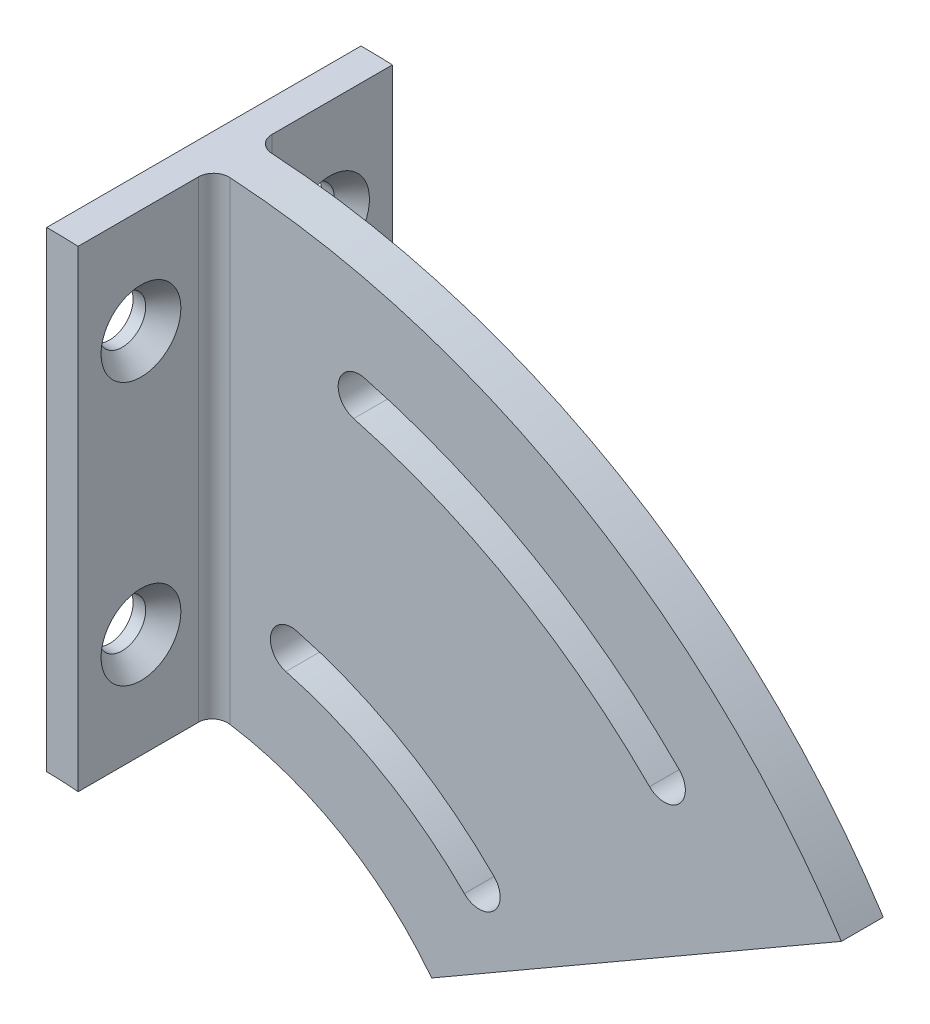
ISO-10303-21;
HEADER;
FILE_DESCRIPTION(('STEP AP214'),'2;1');
FILE_NAME('part.step','',(''),(''),'','','');
FILE_SCHEMA(('AUTOMOTIVE_DESIGN { 1 0 10303 214 1 1 1 1 }'));
ENDSEC;
DATA;
#1=APPLICATION_CONTEXT('core data for automotive mechanical design processes');
#2=APPLICATION_PROTOCOL_DEFINITION('international standard','automotive_design',2000,#1);
#3=PRODUCT_CONTEXT('',#1,'mechanical');
#4=PRODUCT('Part','Part','',(#3));
#5=PRODUCT_RELATED_PRODUCT_CATEGORY('part','',(#4));
#6=PRODUCT_DEFINITION_FORMATION('','',#4);
#7=PRODUCT_DEFINITION_CONTEXT('part definition',#1,'design');
#8=PRODUCT_DEFINITION('design','',#6,#7);
#9=PRODUCT_DEFINITION_SHAPE('','',#8);
#10=(LENGTH_UNIT() NAMED_UNIT(*) SI_UNIT(.MILLI.,.METRE.));
#11=(NAMED_UNIT(*) PLANE_ANGLE_UNIT() SI_UNIT($,.RADIAN.));
#12=(NAMED_UNIT(*) SI_UNIT($,.STERADIAN.) SOLID_ANGLE_UNIT());
#13=UNCERTAINTY_MEASURE_WITH_UNIT(LENGTH_MEASURE(1.E-05),#10,'distance_accuracy_value','');
#14=(GEOMETRIC_REPRESENTATION_CONTEXT(3) GLOBAL_UNCERTAINTY_ASSIGNED_CONTEXT((#13)) GLOBAL_UNIT_ASSIGNED_CONTEXT((#10,
#11,#12)) REPRESENTATION_CONTEXT('',''));
#15=CARTESIAN_POINT('',(0.,0.,0.));
#16=DIRECTION('',(0.,0.,1.));
#17=DIRECTION('',(1.,0.,0.));
#18=AXIS2_PLACEMENT_3D('',#15,#16,#17);
#19=CARTESIAN_POINT('',(-2.00000000000002,3.46410161513775,2.));
#20=DIRECTION('',(-0.500000000000004,0.866025403784436,0.));
#21=DIRECTION('',(-0.866025403784436,-0.500000000000004,0.));
#22=AXIS2_PLACEMENT_3D('',#19,#20,#21);
#23=PLANE('',#22);
#24=DIRECTION('',(0.866025403784436,0.500000000000004,0.));
#25=VECTOR('',#24,1.);
#26=CARTESIAN_POINT('',(-2.00000000000002,3.46410161513775,-2.));
#27=LINE('',#26,#25);
#28=CARTESIAN_POINT('',(23.7487863791674,18.3301703624564,-2.));
#29=VERTEX_POINT('',#28);
#30=CARTESIAN_POINT('',(62.8594634575401,40.9107303018436,-2.));
#31=VERTEX_POINT('',#30);
#32=EDGE_CURVE('E287',#29,#31,#27,.T.);
#33=ORIENTED_EDGE('',*,*,#32,.T.);
#34=DIRECTION('',(0.,0.,-1.));
#35=VECTOR('',#34,1.);
#36=CARTESIAN_POINT('',(62.8594634575401,40.9107303018436,2.));
#37=LINE('',#36,#35);
#38=CARTESIAN_POINT('',(62.8594634575401,40.9107303018436,2.));
#39=VERTEX_POINT('',#38);
#40=EDGE_CURVE('E300',#39,#31,#37,.T.);
#41=ORIENTED_EDGE('',*,*,#40,.F.);
#42=DIRECTION('',(0.866025403784436,0.500000000000004,0.));
#43=VECTOR('',#42,1.);
#44=CARTESIAN_POINT('',(-2.00000000000002,3.46410161513775,2.));
#45=LINE('',#44,#43);
#46=CARTESIAN_POINT('',(23.7487863791674,18.3301703624564,2.));
#47=VERTEX_POINT('',#46);
#48=EDGE_CURVE('E247',#47,#39,#45,.T.);
#49=ORIENTED_EDGE('',*,*,#48,.F.);
#50=DIRECTION('',(0.,0.,-1.));
#51=VECTOR('',#50,1.);
#52=CARTESIAN_POINT('',(23.7487863791674,18.3301703624564,2.));
#53=LINE('',#52,#51);
#54=EDGE_CURVE('E297',#47,#29,#53,.T.);
#55=ORIENTED_EDGE('',*,*,#54,.T.);
#56=EDGE_LOOP('',(#33,#41,#49,#55));
#57=FACE_BOUND('',#56,.T.);
#58=ADVANCED_FACE('F47',(#57),#23,.F.);
#59=CARTESIAN_POINT('',(0.,0.,2.));
#60=DIRECTION('',(0.,0.,-1.));
#61=DIRECTION('',(-1.,0.,0.));
#62=AXIS2_PLACEMENT_3D('',#59,#60,#61);
#63=CYLINDRICAL_SURFACE('',#62,75.);
#64=CARTESIAN_POINT('',(0.,0.,-2.));
#65=DIRECTION('',(0.,0.,1.));
#66=DIRECTION('',(1.,0.,0.));
#67=AXIS2_PLACEMENT_3D('',#64,#65,#66);
#68=CIRCLE('',#67,75.);
#69=CARTESIAN_POINT('',(4.5,74.8648782808067,-2.));
#70=VERTEX_POINT('',#69);
#71=EDGE_CURVE('E291',#31,#70,#68,.T.);
#72=ORIENTED_EDGE('',*,*,#71,.T.);
#73=CARTESIAN_POINT('',(4.5,74.8648782808067,-2.));
#74=CARTESIAN_POINT('',(4.45777980435427,74.8674162648847,-2.00000031695284));
#75=CARTESIAN_POINT('',(4.41557756249627,74.8699168792832,-2.00178366696298));
#76=CARTESIAN_POINT('',(4.33146997195856,74.8748298046333,-2.00889951308917));
#77=CARTESIAN_POINT('',(4.28956461142635,74.8772421191262,-2.01423186670088));
#78=CARTESIAN_POINT('',(4.16481265104597,74.8843190565613,-2.03550468509653));
#79=CARTESIAN_POINT('',(4.08279419593264,74.8888318335639,-2.05672103353361));
#80=CARTESIAN_POINT('',(3.92346468852666,74.8973484992588,-2.112646774287));
#81=CARTESIAN_POINT('',(3.84615609816962,74.901352122976,-2.14736315450511));
#82=CARTESIAN_POINT('',(3.69845818680558,74.9087903752296,-2.22930834480205));
#83=CARTESIAN_POINT('',(3.62806749754371,74.9122251163747,-2.27653467374875));
#84=CARTESIAN_POINT('',(3.49628931821994,74.9184911601753,-2.38210618038562));
#85=CARTESIAN_POINT('',(3.43489192136444,74.9213231284137,-2.44043895800311));
#86=CARTESIAN_POINT('',(3.32274647489676,74.9263806354733,-2.56661988940331));
#87=CARTESIAN_POINT('',(3.27200051451136,74.9286060553484,-2.63446990559962));
#88=CARTESIAN_POINT('',(3.18267160727606,74.9324536225646,-2.77766801192445));
#89=CARTESIAN_POINT('',(3.14407693594115,74.9340763517007,-2.85300878145447));
#90=CARTESIAN_POINT('',(3.08010074664251,74.9367333888482,-3.0090938273469));
#91=CARTESIAN_POINT('',(3.0547113316928,74.9377680485704,-3.08983484158068));
#92=CARTESIAN_POINT('',(3.02422374514937,74.9390032998763,-3.22589757013268));
#93=CARTESIAN_POINT('',(3.0151452925313,74.9393685716387,-3.28035917786629));
#94=CARTESIAN_POINT('',(3.00303427449589,74.9398545212724,-3.38987287177392));
#95=CARTESIAN_POINT('',(2.99999311454872,74.9399755468502,-3.44492400622536));
#96=CARTESIAN_POINT('',(3.,74.9399759807808,-3.5));
#97=B_SPLINE_CURVE_WITH_KNOTS('',3,(#73,#74,#75,#76,#77,#78,#79,#80,#81,#82,#83,#84,#85,#86,#87,
#88,#89,#90,#91,#92,#93,#94,#95,#96),.UNSPECIFIED.,.F.,.F.,(4,2,2,2,2,2,2,2,2,2,2,4),(0.,
0.126811517790267,0.253617943981932,0.506827327821661,0.760167953028892,1.01345837007314,
1.26646763558903,1.51952648134642,1.77234040309706,2.02500296313642,2.19033402326566,
2.35542955322012),.UNSPECIFIED.);
#98=CARTESIAN_POINT('',(3.,74.9399759807807,-3.5));
#99=VERTEX_POINT('',#98);
#100=EDGE_CURVE('E62',#70,#99,#97,.T.);
#101=ORIENTED_EDGE('',*,*,#100,.T.);
#102=DIRECTION('',(0.,0.,-1.));
#103=VECTOR('',#102,1.);
#104=CARTESIAN_POINT('',(3.,74.9399759807807,15.));
#105=LINE('',#104,#103);
#106=CARTESIAN_POINT('',(3.,74.9399759807807,-15.));
#107=VERTEX_POINT('',#106);
#108=EDGE_CURVE('E206',#99,#107,#105,.T.);
#109=ORIENTED_EDGE('',*,*,#108,.T.);
#110=CARTESIAN_POINT('',(0.,0.,-15.));
#111=DIRECTION('',(0.,0.,1.));
#112=DIRECTION('',(1.,0.,0.));
#113=AXIS2_PLACEMENT_3D('',#110,#111,#112);
#114=CIRCLE('',#113,75.);
#115=CARTESIAN_POINT('',(0.,75.,-15.));
#116=VERTEX_POINT('',#115);
#117=EDGE_CURVE('E458',#107,#116,#114,.T.);
#118=ORIENTED_EDGE('',*,*,#117,.T.);
#119=DIRECTION('',(0.,0.,-1.));
#120=VECTOR('',#119,1.);
#121=CARTESIAN_POINT('',(0.,75.,15.));
#122=LINE('',#121,#120);
#123=CARTESIAN_POINT('',(0.,75.,15.));
#124=VERTEX_POINT('',#123);
#125=EDGE_CURVE('E182',#124,#116,#122,.T.);
#126=ORIENTED_EDGE('',*,*,#125,.F.);
#127=CARTESIAN_POINT('',(0.,0.,15.));
#128=DIRECTION('',(0.,0.,1.));
#129=DIRECTION('',(1.,0.,0.));
#130=AXIS2_PLACEMENT_3D('',#127,#128,#129);
#131=CIRCLE('',#130,75.);
#132=CARTESIAN_POINT('',(3.,74.9399759807807,15.));
#133=VERTEX_POINT('',#132);
#134=EDGE_CURVE('E176',#133,#124,#131,.T.);
#135=ORIENTED_EDGE('',*,*,#134,.F.);
#136=CARTESIAN_POINT('',(3.,74.9399759807807,3.5));
#137=VERTEX_POINT('',#136);
#138=EDGE_CURVE('E180',#133,#137,#105,.T.);
#139=ORIENTED_EDGE('',*,*,#138,.T.);
#140=CARTESIAN_POINT('',(3.,74.9399759807807,3.5));
#141=CARTESIAN_POINT('',(3.0000002634625,74.9399757650584,3.4578262428091));
#142=CARTESIAN_POINT('',(3.00177974367625,74.9399047570605,3.41567269461653));
#143=CARTESIAN_POINT('',(3.00887869885395,74.9396201457445,3.33166735088973));
#144=CARTESIAN_POINT('',(3.01419800094302,74.9394065493898,3.28981554072035));
#145=CARTESIAN_POINT('',(3.03541467835634,74.9385513014973,3.16523687323369));
#146=CARTESIAN_POINT('',(3.05657096737965,74.9376951963688,3.08334467447728));
#147=CARTESIAN_POINT('',(3.11231772911564,74.9354004954242,2.92427999420264));
#148=CARTESIAN_POINT('',(3.14691459532293,74.9339616223797,2.84710977911817));
#149=CARTESIAN_POINT('',(3.22855212348645,74.9304885459524,2.69967824128908));
#150=CARTESIAN_POINT('',(3.27559063807879,74.9284544452964,2.62941572917857));
#151=CARTESIAN_POINT('',(3.38078313270072,74.9237817349491,2.49777459044907));
#152=CARTESIAN_POINT('',(3.43893958618147,74.9211429907145,2.4363979460533));
#153=CARTESIAN_POINT('',(3.56471878237382,74.9152636982268,2.32426731115949));
#154=CARTESIAN_POINT('',(3.63234335039084,74.9120230338933,2.27351537365859));
#155=CARTESIAN_POINT('',(3.77518321911707,74.9049604830548,2.18403927094436));
#156=CARTESIAN_POINT('',(3.85040564490313,74.9011380492466,2.14532653715862));
#157=CARTESIAN_POINT('',(4.00624013862916,74.8929643615934,2.08109434098785));
#158=CARTESIAN_POINT('',(4.08684916931042,74.8886134046451,2.0555675133953));
#159=CARTESIAN_POINT('',(4.2232834411006,74.8810179104093,2.02469126574216));
#160=CARTESIAN_POINT('',(4.2782639273522,74.8778972507124,2.01543693801216));
#161=CARTESIAN_POINT('',(4.38882338716534,74.8714987327121,2.00309209303521));
#162=CARTESIAN_POINT('',(4.4444013905691,74.8682211059997,1.99999276510663));
#163=CARTESIAN_POINT('',(4.5,74.8648782808067,2.));
#164=B_SPLINE_CURVE_WITH_KNOTS('',3,(#140,#141,#142,#143,#144,#145,#146,#147,#148,#149,#150,
#151,#152,#153,#154,#155,#156,#157,#158,#159,#160,#161,#162,#163),.UNSPECIFIED.,.F.,.F.,(4,2,2,
2,2,2,2,2,2,2,2,4),(0.,0.126443542336039,0.252880909981201,0.505334759188511,0.757908844494311,
1.01043936523855,1.26302613294937,1.51566166268756,1.76853634684521,2.02126963048289,
2.1884721855707,2.35543522262994),.UNSPECIFIED.);
#165=CARTESIAN_POINT('',(4.5,74.8648782808067,2.));
#166=VERTEX_POINT('',#165);
#167=EDGE_CURVE('E362',#137,#166,#164,.T.);
#168=ORIENTED_EDGE('',*,*,#167,.T.);
#169=CARTESIAN_POINT('',(0.,0.,2.));
#170=DIRECTION('',(0.,0.,1.));
#171=DIRECTION('',(1.,0.,0.));
#172=AXIS2_PLACEMENT_3D('',#169,#170,#171);
#173=CIRCLE('',#172,75.);
#174=EDGE_CURVE('E251',#39,#166,#173,.T.);
#175=ORIENTED_EDGE('',*,*,#174,.F.);
#176=ORIENTED_EDGE('',*,*,#40,.T.);
#177=EDGE_LOOP('',(#72,#101,#109,#118,#126,#135,#139,#168,#175,#176));
#178=FACE_BOUND('',#177,.T.);
#179=ADVANCED_FACE('F178',(#178),#63,.T.);
#180=CARTESIAN_POINT('',(10.3527618041011,38.6370330515627,2.));
#181=DIRECTION('',(0.,0.,-1.));
#182=DIRECTION('',(-1.,0.,0.));
#183=AXIS2_PLACEMENT_3D('',#180,#181,#182);
#184=CYLINDRICAL_SURFACE('',#183,2.);
#185=CARTESIAN_POINT('',(10.3527618041011,38.6370330515627,-2.));
#186=DIRECTION('',(0.,0.,1.));
#187=DIRECTION('',(1.,0.,0.));
#188=AXIS2_PLACEMENT_3D('',#185,#186,#187);
#189=CIRCLE('',#188,2.);
#190=CARTESIAN_POINT('',(10.8703998943062,40.5688847041408,-2.));
#191=VERTEX_POINT('',#190);
#192=CARTESIAN_POINT('',(9.83512371389607,36.7051813989845,-2.));
#193=VERTEX_POINT('',#192);
#194=EDGE_CURVE('E271',#191,#193,#189,.T.);
#195=ORIENTED_EDGE('',*,*,#194,.F.);
#196=DIRECTION('',(0.,0.,-1.));
#197=VECTOR('',#196,1.);
#198=CARTESIAN_POINT('',(10.8703998943062,40.5688847041408,2.));
#199=LINE('',#198,#197);
#200=CARTESIAN_POINT('',(10.8703998943062,40.5688847041408,2.));
#201=VERTEX_POINT('',#200);
#202=EDGE_CURVE('E301',#201,#191,#199,.T.);
#203=ORIENTED_EDGE('',*,*,#202,.F.);
#204=CARTESIAN_POINT('',(10.3527618041011,38.6370330515627,2.));
#205=DIRECTION('',(0.,0.,1.));
#206=DIRECTION('',(1.,0.,0.));
#207=AXIS2_PLACEMENT_3D('',#204,#205,#206);
#208=CIRCLE('',#207,2.);
#209=CARTESIAN_POINT('',(9.83512371389607,36.7051813989845,2.));
#210=VERTEX_POINT('',#209);
#211=EDGE_CURVE('E232',#201,#210,#208,.T.);
#212=ORIENTED_EDGE('',*,*,#211,.T.);
#213=DIRECTION('',(0.,0.,-1.));
#214=VECTOR('',#213,1.);
#215=CARTESIAN_POINT('',(9.83512371389607,36.7051813989845,2.));
#216=LINE('',#215,#214);
#217=EDGE_CURVE('E305',#210,#193,#216,.T.);
#218=ORIENTED_EDGE('',*,*,#217,.T.);
#219=EDGE_LOOP('',(#195,#203,#212,#218));
#220=FACE_BOUND('',#219,.T.);
#221=ADVANCED_FACE('F403',(#220),#184,.F.);
#222=CARTESIAN_POINT('',(0.,0.,2.));
#223=DIRECTION('',(0.,0.,-1.));
#224=DIRECTION('',(-1.,0.,0.));
#225=AXIS2_PLACEMENT_3D('',#222,#223,#224);
#226=CYLINDRICAL_SURFACE('',#225,42.);
#227=CARTESIAN_POINT('',(0.,0.,-2.));
#228=DIRECTION('',(0.,0.,1.));
#229=DIRECTION('',(1.,0.,0.));
#230=AXIS2_PLACEMENT_3D('',#227,#228,#229);
#231=CIRCLE('',#230,42.);
#232=CARTESIAN_POINT('',(29.698484809835,29.6984848098349,-2.));
#233=VERTEX_POINT('',#232);
#234=EDGE_CURVE('E275',#233,#191,#231,.T.);
#235=ORIENTED_EDGE('',*,*,#234,.F.);
#236=DIRECTION('',(0.,0.,-1.));
#237=VECTOR('',#236,1.);
#238=CARTESIAN_POINT('',(29.698484809835,29.6984848098349,2.));
#239=LINE('',#238,#237);
#240=CARTESIAN_POINT('',(29.698484809835,29.6984848098349,2.));
#241=VERTEX_POINT('',#240);
#242=EDGE_CURVE('E312',#241,#233,#239,.T.);
#243=ORIENTED_EDGE('',*,*,#242,.F.);
#244=CARTESIAN_POINT('',(0.,0.,2.));
#245=DIRECTION('',(0.,0.,1.));
#246=DIRECTION('',(1.,0.,0.));
#247=AXIS2_PLACEMENT_3D('',#244,#245,#246);
#248=CIRCLE('',#247,42.);
#249=EDGE_CURVE('E236',#241,#201,#248,.T.);
#250=ORIENTED_EDGE('',*,*,#249,.T.);
#251=ORIENTED_EDGE('',*,*,#202,.T.);
#252=EDGE_LOOP('',(#235,#243,#250,#251));
#253=FACE_BOUND('',#252,.T.);
#254=ADVANCED_FACE('F406',(#253),#226,.F.);
#255=CARTESIAN_POINT('',(28.2842712474619,28.2842712474618,2.));
#256=DIRECTION('',(0.,0.,-1.));
#257=DIRECTION('',(-1.,0.,0.));
#258=AXIS2_PLACEMENT_3D('',#255,#256,#257);
#259=CYLINDRICAL_SURFACE('',#258,2.);
#260=CARTESIAN_POINT('',(28.2842712474619,28.2842712474618,-2.));
#261=DIRECTION('',(0.,0.,1.));
#262=DIRECTION('',(1.,0.,0.));
#263=AXIS2_PLACEMENT_3D('',#260,#261,#262);
#264=CIRCLE('',#263,2.);
#265=CARTESIAN_POINT('',(26.8700576850888,26.8700576850888,-2.));
#266=VERTEX_POINT('',#265);
#267=EDGE_CURVE('E279',#266,#233,#264,.T.);
#268=ORIENTED_EDGE('',*,*,#267,.F.);
#269=DIRECTION('',(0.,0.,-1.));
#270=VECTOR('',#269,1.);
#271=CARTESIAN_POINT('',(26.8700576850888,26.8700576850888,2.));
#272=LINE('',#271,#270);
#273=CARTESIAN_POINT('',(26.8700576850888,26.8700576850888,2.));
#274=VERTEX_POINT('',#273);
#275=EDGE_CURVE('E308',#274,#266,#272,.T.);
#276=ORIENTED_EDGE('',*,*,#275,.F.);
#277=CARTESIAN_POINT('',(28.2842712474619,28.2842712474618,2.));
#278=DIRECTION('',(0.,0.,1.));
#279=DIRECTION('',(1.,0.,0.));
#280=AXIS2_PLACEMENT_3D('',#277,#278,#279);
#281=CIRCLE('',#280,2.);
#282=EDGE_CURVE('E240',#274,#241,#281,.T.);
#283=ORIENTED_EDGE('',*,*,#282,.T.);
#284=ORIENTED_EDGE('',*,*,#242,.T.);
#285=EDGE_LOOP('',(#268,#276,#283,#284));
#286=FACE_BOUND('',#285,.T.);
#287=ADVANCED_FACE('F388',(#286),#259,.F.);
#288=CARTESIAN_POINT('',(16.8232379316643,62.7851787087893,2.));
#289=DIRECTION('',(0.,0.,-1.));
#290=DIRECTION('',(-1.,0.,0.));
#291=AXIS2_PLACEMENT_3D('',#288,#289,#290);
#292=CYLINDRICAL_SURFACE('',#291,2.00000000000001);
#293=CARTESIAN_POINT('',(16.8232379316643,62.7851787087893,-2.));
#294=DIRECTION('',(0.,0.,1.));
#295=DIRECTION('',(1.,0.,0.));
#296=AXIS2_PLACEMENT_3D('',#293,#294,#295);
#297=CIRCLE('',#296,2.00000000000001);
#298=CARTESIAN_POINT('',(17.3408760218694,64.7170303613674,-2.));
#299=VERTEX_POINT('',#298);
#300=CARTESIAN_POINT('',(16.3055998414593,60.8533270562112,-2.));
#301=VERTEX_POINT('',#300);
#302=EDGE_CURVE('E205',#299,#301,#297,.T.);
#303=ORIENTED_EDGE('',*,*,#302,.F.);
#304=DIRECTION('',(0.,0.,-1.));
#305=VECTOR('',#304,1.);
#306=CARTESIAN_POINT('',(17.3408760218694,64.7170303613674,2.));
#307=LINE('',#306,#305);
#308=CARTESIAN_POINT('',(17.3408760218694,64.7170303613674,2.));
#309=VERTEX_POINT('',#308);
#310=EDGE_CURVE('E309',#309,#299,#307,.T.);
#311=ORIENTED_EDGE('',*,*,#310,.F.);
#312=CARTESIAN_POINT('',(16.8232379316643,62.7851787087893,2.));
#313=DIRECTION('',(0.,0.,1.));
#314=DIRECTION('',(1.,0.,0.));
#315=AXIS2_PLACEMENT_3D('',#312,#313,#314);
#316=CIRCLE('',#315,2.00000000000001);
#317=CARTESIAN_POINT('',(16.3055998414593,60.8533270562112,2.));
#318=VERTEX_POINT('',#317);
#319=EDGE_CURVE('E216',#309,#318,#316,.T.);
#320=ORIENTED_EDGE('',*,*,#319,.T.);
#321=DIRECTION('',(0.,0.,-1.));
#322=VECTOR('',#321,1.);
#323=CARTESIAN_POINT('',(16.3055998414593,60.8533270562112,2.));
#324=LINE('',#323,#322);
#325=EDGE_CURVE('E258',#318,#301,#324,.T.);
#326=ORIENTED_EDGE('',*,*,#325,.T.);
#327=EDGE_LOOP('',(#303,#311,#320,#326));
#328=FACE_BOUND('',#327,.T.);
#329=ADVANCED_FACE('F383',(#328),#292,.F.);
#330=CARTESIAN_POINT('',(0.,0.,2.));
#331=DIRECTION('',(0.,0.,-1.));
#332=DIRECTION('',(-1.,0.,0.));
#333=AXIS2_PLACEMENT_3D('',#330,#331,#332);
#334=CYLINDRICAL_SURFACE('',#333,67.);
#335=CARTESIAN_POINT('',(0.,0.,-2.));
#336=DIRECTION('',(0.,0.,1.));
#337=DIRECTION('',(1.,0.,0.));
#338=AXIS2_PLACEMENT_3D('',#335,#336,#337);
#339=CIRCLE('',#338,67.);
#340=CARTESIAN_POINT('',(47.3761543394988,47.3761543394986,-2.));
#341=VERTEX_POINT('',#340);
#342=EDGE_CURVE('E211',#341,#299,#339,.T.);
#343=ORIENTED_EDGE('',*,*,#342,.F.);
#344=DIRECTION('',(0.,0.,-1.));
#345=VECTOR('',#344,1.);
#346=CARTESIAN_POINT('',(47.3761543394988,47.3761543394986,2.));
#347=LINE('',#346,#345);
#348=CARTESIAN_POINT('',(47.3761543394988,47.3761543394986,2.));
#349=VERTEX_POINT('',#348);
#350=EDGE_CURVE('E322',#349,#341,#347,.T.);
#351=ORIENTED_EDGE('',*,*,#350,.F.);
#352=CARTESIAN_POINT('',(0.,0.,2.));
#353=DIRECTION('',(0.,0.,1.));
#354=DIRECTION('',(1.,0.,0.));
#355=AXIS2_PLACEMENT_3D('',#352,#353,#354);
#356=CIRCLE('',#355,67.);
#357=EDGE_CURVE('E220',#349,#309,#356,.T.);
#358=ORIENTED_EDGE('',*,*,#357,.T.);
#359=ORIENTED_EDGE('',*,*,#310,.T.);
#360=EDGE_LOOP('',(#343,#351,#358,#359));
#361=FACE_BOUND('',#360,.T.);
#362=ADVANCED_FACE('F387',(#361),#334,.F.);
#363=CARTESIAN_POINT('',(45.9619407771257,45.9619407771255,2.));
#364=DIRECTION('',(0.,0.,-1.));
#365=DIRECTION('',(-1.,0.,0.));
#366=AXIS2_PLACEMENT_3D('',#363,#364,#365);
#367=CYLINDRICAL_SURFACE('',#366,2.);
#368=CARTESIAN_POINT('',(45.9619407771257,45.9619407771255,-2.));
#369=DIRECTION('',(0.,0.,1.));
#370=DIRECTION('',(1.,0.,0.));
#371=AXIS2_PLACEMENT_3D('',#368,#369,#370);
#372=CIRCLE('',#371,2.);
#373=CARTESIAN_POINT('',(44.5477272147526,44.5477272147524,-2.));
#374=VERTEX_POINT('',#373);
#375=EDGE_CURVE('E263',#374,#341,#372,.T.);
#376=ORIENTED_EDGE('',*,*,#375,.F.);
#377=DIRECTION('',(0.,0.,-1.));
#378=VECTOR('',#377,1.);
#379=CARTESIAN_POINT('',(44.5477272147526,44.5477272147524,2.));
#380=LINE('',#379,#378);
#381=CARTESIAN_POINT('',(44.5477272147526,44.5477272147524,2.));
#382=VERTEX_POINT('',#381);
#383=EDGE_CURVE('E319',#382,#374,#380,.T.);
#384=ORIENTED_EDGE('',*,*,#383,.F.);
#385=CARTESIAN_POINT('',(45.9619407771257,45.9619407771255,2.));
#386=DIRECTION('',(0.,0.,1.));
#387=DIRECTION('',(1.,0.,0.));
#388=AXIS2_PLACEMENT_3D('',#385,#386,#387);
#389=CIRCLE('',#388,2.);
#390=EDGE_CURVE('E225',#382,#349,#389,.T.);
#391=ORIENTED_EDGE('',*,*,#390,.T.);
#392=ORIENTED_EDGE('',*,*,#350,.T.);
#393=EDGE_LOOP('',(#376,#384,#391,#392));
#394=FACE_BOUND('',#393,.T.);
#395=ADVANCED_FACE('F392',(#394),#367,.F.);
#396=CARTESIAN_POINT('',(0.,0.,2.));
#397=DIRECTION('',(0.,0.,-1.));
#398=DIRECTION('',(-1.,0.,0.));
#399=AXIS2_PLACEMENT_3D('',#396,#397,#398);
#400=CYLINDRICAL_SURFACE('',#399,38.);
#401=CARTESIAN_POINT('',(0.,0.,-2.));
#402=DIRECTION('',(0.,0.,1.));
#403=DIRECTION('',(1.,0.,0.));
#404=AXIS2_PLACEMENT_3D('',#401,#402,#403);
#405=CIRCLE('',#404,38.);
#406=EDGE_CURVE('E283',#266,#193,#405,.T.);
#407=ORIENTED_EDGE('',*,*,#406,.T.);
#408=ORIENTED_EDGE('',*,*,#217,.F.);
#409=CARTESIAN_POINT('',(0.,0.,2.));
#410=DIRECTION('',(0.,0.,1.));
#411=DIRECTION('',(1.,0.,0.));
#412=AXIS2_PLACEMENT_3D('',#409,#410,#411);
#413=CIRCLE('',#412,38.);
#414=EDGE_CURVE('E244',#274,#210,#413,.T.);
#415=ORIENTED_EDGE('',*,*,#414,.F.);
#416=ORIENTED_EDGE('',*,*,#275,.T.);
#417=EDGE_LOOP('',(#407,#408,#415,#416));
#418=FACE_BOUND('',#417,.T.);
#419=ADVANCED_FACE('F396',(#418),#400,.T.);
#420=CARTESIAN_POINT('',(0.,0.,2.));
#421=DIRECTION('',(0.,0.,-1.));
#422=DIRECTION('',(-1.,0.,0.));
#423=AXIS2_PLACEMENT_3D('',#420,#421,#422);
#424=CYLINDRICAL_SURFACE('',#423,63.);
#425=CARTESIAN_POINT('',(0.,0.,-2.));
#426=DIRECTION('',(0.,0.,1.));
#427=DIRECTION('',(1.,0.,0.));
#428=AXIS2_PLACEMENT_3D('',#425,#426,#427);
#429=CIRCLE('',#428,63.);
#430=EDGE_CURVE('E267',#374,#301,#429,.T.);
#431=ORIENTED_EDGE('',*,*,#430,.T.);
#432=ORIENTED_EDGE('',*,*,#325,.F.);
#433=CARTESIAN_POINT('',(0.,0.,2.));
#434=DIRECTION('',(0.,0.,1.));
#435=DIRECTION('',(1.,0.,0.));
#436=AXIS2_PLACEMENT_3D('',#433,#434,#435);
#437=CIRCLE('',#436,63.);
#438=EDGE_CURVE('E229',#382,#318,#437,.T.);
#439=ORIENTED_EDGE('',*,*,#438,.F.);
#440=ORIENTED_EDGE('',*,*,#383,.T.);
#441=EDGE_LOOP('',(#431,#432,#439,#440));
#442=FACE_BOUND('',#441,.T.);
#443=ADVANCED_FACE('F398',(#442),#424,.T.);
#444=CARTESIAN_POINT('',(0.,0.,2.));
#445=DIRECTION('',(0.,0.,-1.));
#446=DIRECTION('',(-1.,0.,0.));
#447=AXIS2_PLACEMENT_3D('',#444,#445,#446);
#448=CYLINDRICAL_SURFACE('',#447,30.);
#449=CARTESIAN_POINT('',(0.,0.,-2.));
#450=DIRECTION('',(0.,0.,1.));
#451=DIRECTION('',(1.,0.,0.));
#452=AXIS2_PLACEMENT_3D('',#449,#450,#451);
#453=CIRCLE('',#452,30.);
#454=CARTESIAN_POINT('',(4.5,29.6605798999278,-2.));
#455=VERTEX_POINT('',#454);
#456=EDGE_CURVE('E221',#29,#455,#453,.T.);
#457=ORIENTED_EDGE('',*,*,#456,.F.);
#458=ORIENTED_EDGE('',*,*,#54,.F.);
#459=CARTESIAN_POINT('',(0.,0.,2.));
#460=DIRECTION('',(0.,0.,1.));
#461=DIRECTION('',(1.,0.,0.));
#462=AXIS2_PLACEMENT_3D('',#459,#460,#461);
#463=CIRCLE('',#462,30.);
#464=CARTESIAN_POINT('',(4.5,29.6605798999278,2.));
#465=VERTEX_POINT('',#464);
#466=EDGE_CURVE('E255',#47,#465,#463,.T.);
#467=ORIENTED_EDGE('',*,*,#466,.T.);
#468=CARTESIAN_POINT('',(4.5,29.6605798999278,2.));
#469=CARTESIAN_POINT('',(4.4576827832355,29.6670006297516,2.00000051059408));
#470=CARTESIAN_POINT('',(4.41537130884786,29.6733267042765,2.00179189410262));
#471=CARTESIAN_POINT('',(4.33101861517601,29.6857556951082,2.00894700499429));
#472=CARTESIAN_POINT('',(4.28897739624448,29.6918586111238,2.01431073703857));
#473=CARTESIAN_POINT('',(4.16375427079795,29.7097665480903,2.03572807524714));
#474=CARTESIAN_POINT('',(4.08136336579032,29.7211873484917,2.05710788453589));
#475=CARTESIAN_POINT('',(3.92120915958054,29.7427414908274,2.11355677827613));
#476=CARTESIAN_POINT('',(3.84344923587682,29.752873899071,2.14863571630304));
#477=CARTESIAN_POINT('',(3.69487034317944,29.7716902569833,2.2315378865899));
#478=CARTESIAN_POINT('',(3.62404917915448,29.7803746653314,2.27935707063626));
#479=CARTESIAN_POINT('',(3.49191063580574,29.7961569220043,2.38603527290852));
#480=CARTESIAN_POINT('',(3.43052991349057,29.8032655000649,2.44481427456365));
#481=CARTESIAN_POINT('',(3.31848123839746,29.8159499298263,2.57199405414292));
#482=CARTESIAN_POINT('',(3.26781540357124,29.8215254785672,2.64039672988337));
#483=CARTESIAN_POINT('',(3.1790453178483,29.8311189458654,2.78433182234573));
#484=CARTESIAN_POINT('',(3.14085441537722,29.83514764483,2.85981015714498));
#485=CARTESIAN_POINT('',(3.07768580519073,29.8417302698146,3.01614290947164));
#486=CARTESIAN_POINT('',(3.0526993635576,29.8442851707617,3.09699373349004));
#487=CARTESIAN_POINT('',(3.02315175598,29.8472894247555,3.23198567758602));
#488=CARTESIAN_POINT('',(3.01447484454451,29.8481657570358,3.2852524677032));
#489=CARTESIAN_POINT('',(3.00290006960635,29.8493316726154,3.39233848388821));
#490=CARTESIAN_POINT('',(2.99999386476253,29.8496221028241,3.44615679939128));
#491=CARTESIAN_POINT('',(3.,29.8496231131986,3.5));
#492=B_SPLINE_CURVE_WITH_KNOTS('',3,(#468,#469,#470,#471,#472,#473,#474,#475,#476,#477,#478,
#479,#480,#481,#482,#483,#484,#485,#486,#487,#488,#489,#490,#491),.UNSPECIFIED.,.F.,.F.,(4,2,2,
2,2,2,2,2,2,2,2,4),(0.,0.128327208258097,0.256654583956306,0.512981194260381,0.769492517001187,
1.02592243026831,1.28054869390638,1.53522524114472,1.78809318933128,2.04079367131823,
2.20242936572544,2.36383125119194),.UNSPECIFIED.);
#493=CARTESIAN_POINT('',(3.,29.8496231131986,3.5));
#494=VERTEX_POINT('',#493);
#495=EDGE_CURVE('E370',#465,#494,#492,.T.);
#496=ORIENTED_EDGE('',*,*,#495,.T.);
#497=DIRECTION('',(0.,0.,-1.));
#498=VECTOR('',#497,1.);
#499=CARTESIAN_POINT('',(3.,29.8496231131986,15.));
#500=LINE('',#499,#498);
#501=CARTESIAN_POINT('',(3.,29.8496231131986,15.));
#502=VERTEX_POINT('',#501);
#503=EDGE_CURVE('E444',#502,#494,#500,.T.);
#504=ORIENTED_EDGE('',*,*,#503,.F.);
#505=CARTESIAN_POINT('',(0.,0.,15.));
#506=DIRECTION('',(0.,0.,1.));
#507=DIRECTION('',(1.,0.,0.));
#508=AXIS2_PLACEMENT_3D('',#505,#506,#507);
#509=CIRCLE('',#508,30.);
#510=CARTESIAN_POINT('',(0.,30.,15.));
#511=VERTEX_POINT('',#510);
#512=EDGE_CURVE('E194',#502,#511,#509,.T.);
#513=ORIENTED_EDGE('',*,*,#512,.T.);
#514=DIRECTION('',(0.,0.,-1.));
#515=VECTOR('',#514,1.);
#516=CARTESIAN_POINT('',(0.,30.,15.));
#517=LINE('',#516,#515);
#518=CARTESIAN_POINT('',(0.,30.,-15.));
#519=VERTEX_POINT('',#518);
#520=EDGE_CURVE('E446',#511,#519,#517,.T.);
#521=ORIENTED_EDGE('',*,*,#520,.T.);
#522=CARTESIAN_POINT('',(0.,0.,-15.));
#523=DIRECTION('',(0.,0.,1.));
#524=DIRECTION('',(1.,0.,0.));
#525=AXIS2_PLACEMENT_3D('',#522,#523,#524);
#526=CIRCLE('',#525,30.);
#527=CARTESIAN_POINT('',(3.,29.8496231131986,-15.));
#528=VERTEX_POINT('',#527);
#529=EDGE_CURVE('E198',#528,#519,#526,.T.);
#530=ORIENTED_EDGE('',*,*,#529,.F.);
#531=CARTESIAN_POINT('',(3.,29.8496231131986,-3.5));
#532=VERTEX_POINT('',#531);
#533=EDGE_CURVE('E431',#532,#528,#500,.T.);
#534=ORIENTED_EDGE('',*,*,#533,.F.);
#535=CARTESIAN_POINT('',(3.,29.8496231131986,-3.5));
#536=CARTESIAN_POINT('',(3.00000017358384,29.8496225834474,-3.45797551371984));
#537=CARTESIAN_POINT('',(3.00176717798253,29.8494455625525,-3.41597118866377));
#538=CARTESIAN_POINT('',(3.00881575914112,29.8487360911571,-3.33226379391963));
#539=CARTESIAN_POINT('',(3.01409714824611,29.8482036596341,-3.29056070826669));
#540=CARTESIAN_POINT('',(3.03516002206942,29.8460720323102,-3.16643244636609));
#541=CARTESIAN_POINT('',(3.05616036770315,29.8439385168684,-3.0848398505825));
#542=CARTESIAN_POINT('',(3.11147741757773,29.8382216663976,-2.92636072837381));
#543=CARTESIAN_POINT('',(3.14580016994994,29.8346376728461,-2.84947635777813));
#544=CARTESIAN_POINT('',(3.22675504970425,29.8259903838114,-2.70258237003762));
#545=CARTESIAN_POINT('',(3.2733852894553,29.820927315165,-2.63257170091267));
#546=CARTESIAN_POINT('',(3.37767055203925,29.8092953590352,-2.50129289138747));
#547=CARTESIAN_POINT('',(3.43534131029503,29.8027243196378,-2.44003744961929));
#548=CARTESIAN_POINT('',(3.55999838358333,29.7880905981384,-2.32807163528071));
#549=CARTESIAN_POINT('',(3.62698636702672,29.7800276487983,-2.27736315539406));
#550=CARTESIAN_POINT('',(3.76867466492202,29.7624294550977,-2.18766215681217));
#551=CARTESIAN_POINT('',(3.84341099164279,29.7528872236039,-2.14872797007768));
#552=CARTESIAN_POINT('',(3.99817442327304,29.7324852490538,-2.08394919823956));
#553=CARTESIAN_POINT('',(4.07819931821928,29.7216260547596,-2.05809918419569));
#554=CARTESIAN_POINT('',(4.21553686603266,29.7023977647114,-2.02610245856691));
#555=CARTESIAN_POINT('',(4.27207080624311,29.694320628878,-2.01631509000702));
#556=CARTESIAN_POINT('',(4.38573847369885,29.677746358643,-2.00326455310389));
#557=CARTESIAN_POINT('',(4.44287117521706,29.6692498717461,-1.99999163023172));
#558=CARTESIAN_POINT('',(4.5,29.6605798999278,-2.));
#559=B_SPLINE_CURVE_WITH_KNOTS('',3,(#535,#536,#537,#538,#539,#540,#541,#542,#543,#544,#545,
#546,#547,#548,#549,#550,#551,#552,#553,#554,#555,#556,#557,#558),.UNSPECIFIED.,.F.,.F.,(4,2,2,
2,2,2,2,2,2,2,2,4),(0.,0.125995917731306,0.251985108295168,0.503523920586957,0.755177060757378,
1.00679162664293,1.25876751082354,1.5107885738886,1.76403847763858,2.01718321555113,
2.19065504378926,2.36386692469417),.UNSPECIFIED.);
#560=EDGE_CURVE('E11',#532,#455,#559,.T.);
#561=ORIENTED_EDGE('',*,*,#560,.T.);
#562=EDGE_LOOP('',(#457,#458,#467,#496,#504,#513,#521,#530,#534,#561));
#563=FACE_BOUND('',#562,.T.);
#564=ADVANCED_FACE('F401',(#563),#448,.F.);
#565=CARTESIAN_POINT('',(0.,0.,2.));
#566=DIRECTION('',(0.,0.,1.));
#567=DIRECTION('',(1.,0.,0.));
#568=AXIS2_PLACEMENT_3D('',#565,#566,#567);
#569=PLANE('',#568);
#570=ORIENTED_EDGE('',*,*,#319,.F.);
#571=ORIENTED_EDGE('',*,*,#357,.F.);
#572=ORIENTED_EDGE('',*,*,#390,.F.);
#573=ORIENTED_EDGE('',*,*,#438,.T.);
#574=EDGE_LOOP('',(#570,#571,#572,#573));
#575=FACE_BOUND('',#574,.T.);
#576=ORIENTED_EDGE('',*,*,#211,.F.);
#577=ORIENTED_EDGE('',*,*,#249,.F.);
#578=ORIENTED_EDGE('',*,*,#282,.F.);
#579=ORIENTED_EDGE('',*,*,#414,.T.);
#580=EDGE_LOOP('',(#576,#577,#578,#579));
#581=FACE_BOUND('',#580,.T.);
#582=ORIENTED_EDGE('',*,*,#174,.T.);
#583=DIRECTION('',(0.,1.,0.));
#584=VECTOR('',#583,1.);
#585=CARTESIAN_POINT('',(4.5,0.,2.));
#586=LINE('',#585,#584);
#587=EDGE_CURVE('E353',#166,#465,#586,.F.);
#588=ORIENTED_EDGE('',*,*,#587,.T.);
#589=ORIENTED_EDGE('',*,*,#466,.F.);
#590=ORIENTED_EDGE('',*,*,#48,.T.);
#591=EDGE_LOOP('',(#582,#588,#589,#590));
#592=FACE_BOUND('',#591,.T.);
#593=ADVANCED_FACE('F436',(#575,#581,#592),#569,.T.);
#594=CARTESIAN_POINT('',(0.,0.,-2.));
#595=DIRECTION('',(0.,0.,1.));
#596=DIRECTION('',(1.,0.,0.));
#597=AXIS2_PLACEMENT_3D('',#594,#595,#596);
#598=PLANE('',#597);
#599=ORIENTED_EDGE('',*,*,#302,.T.);
#600=ORIENTED_EDGE('',*,*,#430,.F.);
#601=ORIENTED_EDGE('',*,*,#375,.T.);
#602=ORIENTED_EDGE('',*,*,#342,.T.);
#603=EDGE_LOOP('',(#599,#600,#601,#602));
#604=FACE_BOUND('',#603,.T.);
#605=ORIENTED_EDGE('',*,*,#194,.T.);
#606=ORIENTED_EDGE('',*,*,#406,.F.);
#607=ORIENTED_EDGE('',*,*,#267,.T.);
#608=ORIENTED_EDGE('',*,*,#234,.T.);
#609=EDGE_LOOP('',(#605,#606,#607,#608));
#610=FACE_BOUND('',#609,.T.);
#611=ORIENTED_EDGE('',*,*,#456,.T.);
#612=DIRECTION('',(0.,1.,0.));
#613=VECTOR('',#612,1.);
#614=CARTESIAN_POINT('',(4.5,74.9399759807807,-2.));
#615=LINE('',#614,#613);
#616=EDGE_CURVE('E356',#455,#70,#615,.T.);
#617=ORIENTED_EDGE('',*,*,#616,.T.);
#618=ORIENTED_EDGE('',*,*,#71,.F.);
#619=ORIENTED_EDGE('',*,*,#32,.F.);
#620=EDGE_LOOP('',(#611,#617,#618,#619));
#621=FACE_BOUND('',#620,.T.);
#622=ADVANCED_FACE('F426',(#604,#610,#621),#598,.F.);
#623=CARTESIAN_POINT('',(3.,0.,15.));
#624=DIRECTION('',(-1.,0.,0.));
#625=DIRECTION('',(0.,-1.,0.));
#626=AXIS2_PLACEMENT_3D('',#623,#624,#625);
#627=PLANE('',#626);
#628=CARTESIAN_POINT('',(3.,64.9399759807807,9.));
#629=DIRECTION('',(1.,0.,0.));
#630=DIRECTION('',(0.,0.,-1.));
#631=AXIS2_PLACEMENT_3D('',#628,#629,#630);
#632=CIRCLE('',#631,3.80999999999999);
#633=CARTESIAN_POINT('',(3.,64.9399759807807,5.19000000000001));
#634=VERTEX_POINT('',#633);
#635=EDGE_CURVE('E489',#634,#634,#632,.T.);
#636=ORIENTED_EDGE('',*,*,#635,.F.);
#637=EDGE_LOOP('',(#636));
#638=FACE_BOUND('',#637,.T.);
#639=CARTESIAN_POINT('',(3.,39.8496231131986,9.));
#640=DIRECTION('',(1.,0.,0.));
#641=DIRECTION('',(0.,0.,-1.));
#642=AXIS2_PLACEMENT_3D('',#639,#640,#641);
#643=CIRCLE('',#642,3.81);
#644=CARTESIAN_POINT('',(3.,39.8496231131986,5.19));
#645=VERTEX_POINT('',#644);
#646=EDGE_CURVE('E337',#645,#645,#643,.T.);
#647=ORIENTED_EDGE('',*,*,#646,.F.);
#648=EDGE_LOOP('',(#647));
#649=FACE_BOUND('',#648,.T.);
#650=ORIENTED_EDGE('',*,*,#503,.T.);
#651=DIRECTION('',(0.,1.,0.));
#652=VECTOR('',#651,1.);
#653=CARTESIAN_POINT('',(3.,0.,3.5));
#654=LINE('',#653,#652);
#655=EDGE_CURVE('E203',#494,#137,#654,.T.);
#656=ORIENTED_EDGE('',*,*,#655,.T.);
#657=ORIENTED_EDGE('',*,*,#138,.F.);
#658=DIRECTION('',(0.,1.,0.));
#659=VECTOR('',#658,1.);
#660=CARTESIAN_POINT('',(3.,0.,15.));
#661=LINE('',#660,#659);
#662=EDGE_CURVE('E188',#502,#133,#661,.T.);
#663=ORIENTED_EDGE('',*,*,#662,.F.);
#664=EDGE_LOOP('',(#650,#656,#657,#663));
#665=FACE_BOUND('',#664,.T.);
#666=ADVANCED_FACE('F201',(#638,#649,#665),#627,.F.);
#667=CARTESIAN_POINT('',(3.,64.9399759807807,-9.));
#668=DIRECTION('',(1.,0.,0.));
#669=DIRECTION('',(0.,0.,-1.));
#670=AXIS2_PLACEMENT_3D('',#667,#668,#669);
#671=CIRCLE('',#670,3.80999999999999);
#672=CARTESIAN_POINT('',(3.,64.9399759807807,-12.81));
#673=VERTEX_POINT('',#672);
#674=EDGE_CURVE('E349',#673,#673,#671,.T.);
#675=ORIENTED_EDGE('',*,*,#674,.F.);
#676=EDGE_LOOP('',(#675));
#677=FACE_BOUND('',#676,.T.);
#678=CARTESIAN_POINT('',(3.,39.8496231131986,-9.));
#679=DIRECTION('',(1.,0.,0.));
#680=DIRECTION('',(0.,0.,-1.));
#681=AXIS2_PLACEMENT_3D('',#678,#679,#680);
#682=CIRCLE('',#681,3.81);
#683=CARTESIAN_POINT('',(3.,39.8496231131986,-12.81));
#684=VERTEX_POINT('',#683);
#685=EDGE_CURVE('E343',#684,#684,#682,.T.);
#686=ORIENTED_EDGE('',*,*,#685,.F.);
#687=EDGE_LOOP('',(#686));
#688=FACE_BOUND('',#687,.T.);
#689=ORIENTED_EDGE('',*,*,#108,.F.);
#690=DIRECTION('',(0.,1.,0.));
#691=VECTOR('',#690,1.);
#692=CARTESIAN_POINT('',(3.,29.8496231131986,-3.5));
#693=LINE('',#692,#691);
#694=EDGE_CURVE('E75',#99,#532,#693,.F.);
#695=ORIENTED_EDGE('',*,*,#694,.T.);
#696=ORIENTED_EDGE('',*,*,#533,.T.);
#697=DIRECTION('',(0.,1.,0.));
#698=VECTOR('',#697,1.);
#699=CARTESIAN_POINT('',(3.,0.,-15.));
#700=LINE('',#699,#698);
#701=EDGE_CURVE('E331',#528,#107,#700,.T.);
#702=ORIENTED_EDGE('',*,*,#701,.T.);
#703=EDGE_LOOP('',(#689,#695,#696,#702));
#704=FACE_BOUND('',#703,.T.);
#705=ADVANCED_FACE('F497',(#677,#688,#704),#627,.F.);
#706=CARTESIAN_POINT('',(0.,0.,15.));
#707=DIRECTION('',(-1.,0.,0.));
#708=DIRECTION('',(0.,0.,1.));
#709=AXIS2_PLACEMENT_3D('',#706,#707,#708);
#710=PLANE('',#709);
#711=CARTESIAN_POINT('',(0.,64.9399759807807,9.));
#712=DIRECTION('',(-1.,0.,0.));
#713=DIRECTION('',(0.,0.,1.));
#714=AXIS2_PLACEMENT_3D('',#711,#712,#713);
#715=CIRCLE('',#714,2.24789999999998);
#716=CARTESIAN_POINT('',(0.,64.9399759807807,11.2479));
#717=VERTEX_POINT('',#716);
#718=EDGE_CURVE('E345',#717,#717,#715,.T.);
#719=ORIENTED_EDGE('',*,*,#718,.F.);
#720=EDGE_LOOP('',(#719));
#721=FACE_BOUND('',#720,.T.);
#722=CARTESIAN_POINT('',(0.,64.9399759807807,-9.));
#723=DIRECTION('',(-1.,0.,0.));
#724=DIRECTION('',(0.,0.,1.));
#725=AXIS2_PLACEMENT_3D('',#722,#723,#724);
#726=CIRCLE('',#725,2.24789999999998);
#727=CARTESIAN_POINT('',(0.,64.9399759807807,-6.75210000000002));
#728=VERTEX_POINT('',#727);
#729=EDGE_CURVE('E339',#728,#728,#726,.T.);
#730=ORIENTED_EDGE('',*,*,#729,.F.);
#731=EDGE_LOOP('',(#730));
#732=FACE_BOUND('',#731,.T.);
#733=CARTESIAN_POINT('',(0.,39.8496231131986,-9.));
#734=DIRECTION('',(-1.,0.,0.));
#735=DIRECTION('',(0.,0.,1.));
#736=AXIS2_PLACEMENT_3D('',#733,#734,#735);
#737=CIRCLE('',#736,2.24789999999999);
#738=CARTESIAN_POINT('',(0.,39.8496231131986,-6.75210000000001));
#739=VERTEX_POINT('',#738);
#740=EDGE_CURVE('E333',#739,#739,#737,.T.);
#741=ORIENTED_EDGE('',*,*,#740,.F.);
#742=EDGE_LOOP('',(#741));
#743=FACE_BOUND('',#742,.T.);
#744=CARTESIAN_POINT('',(0.,39.8496231131986,9.));
#745=DIRECTION('',(-1.,0.,0.));
#746=DIRECTION('',(0.,0.,1.));
#747=AXIS2_PLACEMENT_3D('',#744,#745,#746);
#748=CIRCLE('',#747,2.24789999999999);
#749=CARTESIAN_POINT('',(0.,39.8496231131986,11.2479));
#750=VERTEX_POINT('',#749);
#751=EDGE_CURVE('E327',#750,#750,#748,.T.);
#752=ORIENTED_EDGE('',*,*,#751,.F.);
#753=EDGE_LOOP('',(#752));
#754=FACE_BOUND('',#753,.T.);
#755=DIRECTION('',(0.,1.,0.));
#756=VECTOR('',#755,1.);
#757=CARTESIAN_POINT('',(0.,0.,-15.));
#758=LINE('',#757,#756);
#759=EDGE_CURVE('E454',#519,#116,#758,.T.);
#760=ORIENTED_EDGE('',*,*,#759,.F.);
#761=ORIENTED_EDGE('',*,*,#520,.F.);
#762=DIRECTION('',(0.,1.,0.));
#763=VECTOR('',#762,1.);
#764=CARTESIAN_POINT('',(0.,0.,15.));
#765=LINE('',#764,#763);
#766=EDGE_CURVE('E187',#511,#124,#765,.T.);
#767=ORIENTED_EDGE('',*,*,#766,.T.);
#768=ORIENTED_EDGE('',*,*,#125,.T.);
#769=EDGE_LOOP('',(#760,#761,#767,#768));
#770=FACE_BOUND('',#769,.T.);
#771=ADVANCED_FACE('F522',(#721,#732,#743,#754,#770),#710,.T.);
#772=CARTESIAN_POINT('',(0.,0.,15.));
#773=DIRECTION('',(0.,0.,1.));
#774=DIRECTION('',(1.,0.,0.));
#775=AXIS2_PLACEMENT_3D('',#772,#773,#774);
#776=PLANE('',#775);
#777=ORIENTED_EDGE('',*,*,#662,.T.);
#778=ORIENTED_EDGE('',*,*,#134,.T.);
#779=ORIENTED_EDGE('',*,*,#766,.F.);
#780=ORIENTED_EDGE('',*,*,#512,.F.);
#781=EDGE_LOOP('',(#777,#778,#779,#780));
#782=FACE_BOUND('',#781,.T.);
#783=ADVANCED_FACE('F192',(#782),#776,.T.);
#784=CARTESIAN_POINT('',(0.,0.,-15.));
#785=DIRECTION('',(0.,0.,1.));
#786=DIRECTION('',(1.,0.,0.));
#787=AXIS2_PLACEMENT_3D('',#784,#785,#786);
#788=PLANE('',#787);
#789=ORIENTED_EDGE('',*,*,#701,.F.);
#790=ORIENTED_EDGE('',*,*,#529,.T.);
#791=ORIENTED_EDGE('',*,*,#759,.T.);
#792=ORIENTED_EDGE('',*,*,#117,.F.);
#793=EDGE_LOOP('',(#789,#790,#791,#792));
#794=FACE_BOUND('',#793,.T.);
#795=ADVANCED_FACE('F514',(#794),#788,.F.);
#796=CARTESIAN_POINT('',(3.,39.8496231131986,9.));
#797=DIRECTION('',(1.,0.,0.));
#798=DIRECTION('',(0.,0.,-1.));
#799=AXIS2_PLACEMENT_3D('',#796,#797,#798);
#800=CYLINDRICAL_SURFACE('',#799,2.24789999999999);
#801=ORIENTED_EDGE('',*,*,#751,.T.);
#802=EDGE_LOOP('',(#801));
#803=FACE_BOUND('',#802,.T.);
#804=CARTESIAN_POINT('',(1.20300951108006,39.8496231131986,9.));
#805=DIRECTION('',(1.,0.,0.));
#806=DIRECTION('',(0.,0.,-1.));
#807=AXIS2_PLACEMENT_3D('',#804,#805,#806);
#808=CIRCLE('',#807,2.24789999999999);
#809=CARTESIAN_POINT('',(1.20300951108006,39.8496231131986,6.75210000000001));
#810=VERTEX_POINT('',#809);
#811=EDGE_CURVE('E332',#810,#810,#808,.T.);
#812=ORIENTED_EDGE('',*,*,#811,.T.);
#813=EDGE_LOOP('',(#812));
#814=FACE_BOUND('',#813,.T.);
#815=ADVANCED_FACE('F504',(#803,#814),#800,.F.);
#816=CARTESIAN_POINT('',(3.,39.8496231131986,9.));
#817=DIRECTION('',(1.,0.,0.));
#818=DIRECTION('',(0.,0.,-1.));
#819=AXIS2_PLACEMENT_3D('',#816,#817,#818);
#820=CONICAL_SURFACE('',#819,3.81,0.715584993317677);
#821=ORIENTED_EDGE('',*,*,#811,.F.);
#822=EDGE_LOOP('',(#821));
#823=FACE_BOUND('',#822,.T.);
#824=ORIENTED_EDGE('',*,*,#646,.T.);
#825=EDGE_LOOP('',(#824));
#826=FACE_BOUND('',#825,.T.);
#827=ADVANCED_FACE('F501',(#823,#826),#820,.F.);
#828=CARTESIAN_POINT('',(3.,39.8496231131986,-9.));
#829=DIRECTION('',(1.,0.,0.));
#830=DIRECTION('',(0.,0.,-1.));
#831=AXIS2_PLACEMENT_3D('',#828,#829,#830);
#832=CYLINDRICAL_SURFACE('',#831,2.24789999999999);
#833=ORIENTED_EDGE('',*,*,#740,.T.);
#834=EDGE_LOOP('',(#833));
#835=FACE_BOUND('',#834,.T.);
#836=CARTESIAN_POINT('',(1.20300951108006,39.8496231131986,-9.));
#837=DIRECTION('',(1.,0.,0.));
#838=DIRECTION('',(0.,0.,-1.));
#839=AXIS2_PLACEMENT_3D('',#836,#837,#838);
#840=CIRCLE('',#839,2.24789999999999);
#841=CARTESIAN_POINT('',(1.20300951108006,39.8496231131986,-11.2479));
#842=VERTEX_POINT('',#841);
#843=EDGE_CURVE('E338',#842,#842,#840,.T.);
#844=ORIENTED_EDGE('',*,*,#843,.T.);
#845=EDGE_LOOP('',(#844));
#846=FACE_BOUND('',#845,.T.);
#847=ADVANCED_FACE('F503',(#835,#846),#832,.F.);
#848=CARTESIAN_POINT('',(3.,39.8496231131986,-9.));
#849=DIRECTION('',(1.,0.,0.));
#850=DIRECTION('',(0.,0.,-1.));
#851=AXIS2_PLACEMENT_3D('',#848,#849,#850);
#852=CONICAL_SURFACE('',#851,3.81,0.715584993317677);
#853=ORIENTED_EDGE('',*,*,#843,.F.);
#854=EDGE_LOOP('',(#853));
#855=FACE_BOUND('',#854,.T.);
#856=ORIENTED_EDGE('',*,*,#685,.T.);
#857=EDGE_LOOP('',(#856));
#858=FACE_BOUND('',#857,.T.);
#859=ADVANCED_FACE('F511',(#855,#858),#852,.F.);
#860=CARTESIAN_POINT('',(3.,64.9399759807807,-9.));
#861=DIRECTION('',(1.,0.,0.));
#862=DIRECTION('',(0.,0.,-1.));
#863=AXIS2_PLACEMENT_3D('',#860,#861,#862);
#864=CYLINDRICAL_SURFACE('',#863,2.24789999999998);
#865=ORIENTED_EDGE('',*,*,#729,.T.);
#866=EDGE_LOOP('',(#865));
#867=FACE_BOUND('',#866,.T.);
#868=CARTESIAN_POINT('',(1.20300951108005,64.9399759807807,-9.));
#869=DIRECTION('',(1.,0.,0.));
#870=DIRECTION('',(0.,0.,-1.));
#871=AXIS2_PLACEMENT_3D('',#868,#869,#870);
#872=CIRCLE('',#871,2.24789999999998);
#873=CARTESIAN_POINT('',(1.20300951108005,64.9399759807807,-11.2479));
#874=VERTEX_POINT('',#873);
#875=EDGE_CURVE('E344',#874,#874,#872,.T.);
#876=ORIENTED_EDGE('',*,*,#875,.T.);
#877=EDGE_LOOP('',(#876));
#878=FACE_BOUND('',#877,.T.);
#879=ADVANCED_FACE('F603',(#867,#878),#864,.F.);
#880=CARTESIAN_POINT('',(3.,64.9399759807807,-9.));
#881=DIRECTION('',(1.,0.,0.));
#882=DIRECTION('',(0.,0.,-1.));
#883=AXIS2_PLACEMENT_3D('',#880,#881,#882);
#884=CONICAL_SURFACE('',#883,3.80999999999999,0.715584993317677);
#885=ORIENTED_EDGE('',*,*,#875,.F.);
#886=EDGE_LOOP('',(#885));
#887=FACE_BOUND('',#886,.T.);
#888=ORIENTED_EDGE('',*,*,#674,.T.);
#889=EDGE_LOOP('',(#888));
#890=FACE_BOUND('',#889,.T.);
#891=ADVANCED_FACE('F594',(#887,#890),#884,.F.);
#892=CARTESIAN_POINT('',(3.,64.9399759807807,9.));
#893=DIRECTION('',(1.,0.,0.));
#894=DIRECTION('',(0.,0.,-1.));
#895=AXIS2_PLACEMENT_3D('',#892,#893,#894);
#896=CYLINDRICAL_SURFACE('',#895,2.24789999999998);
#897=ORIENTED_EDGE('',*,*,#718,.T.);
#898=EDGE_LOOP('',(#897));
#899=FACE_BOUND('',#898,.T.);
#900=CARTESIAN_POINT('',(1.20300951108005,64.9399759807807,9.));
#901=DIRECTION('',(1.,0.,0.));
#902=DIRECTION('',(0.,0.,-1.));
#903=AXIS2_PLACEMENT_3D('',#900,#901,#902);
#904=CIRCLE('',#903,2.24789999999998);
#905=CARTESIAN_POINT('',(1.20300951108005,64.9399759807807,6.75210000000002));
#906=VERTEX_POINT('',#905);
#907=EDGE_CURVE('E350',#906,#906,#904,.T.);
#908=ORIENTED_EDGE('',*,*,#907,.T.);
#909=EDGE_LOOP('',(#908));
#910=FACE_BOUND('',#909,.T.);
#911=ADVANCED_FACE('F585',(#899,#910),#896,.F.);
#912=CARTESIAN_POINT('',(3.,64.9399759807807,9.));
#913=DIRECTION('',(1.,0.,0.));
#914=DIRECTION('',(0.,0.,-1.));
#915=AXIS2_PLACEMENT_3D('',#912,#913,#914);
#916=CONICAL_SURFACE('',#915,3.80999999999999,0.715584993317677);
#917=ORIENTED_EDGE('',*,*,#907,.F.);
#918=EDGE_LOOP('',(#917));
#919=FACE_BOUND('',#918,.T.);
#920=ORIENTED_EDGE('',*,*,#635,.T.);
#921=EDGE_LOOP('',(#920));
#922=FACE_BOUND('',#921,.T.);
#923=ADVANCED_FACE('F381',(#919,#922),#916,.F.);
#924=CARTESIAN_POINT('',(4.5,0.,3.5));
#925=DIRECTION('',(0.,1.,0.));
#926=DIRECTION('',(-1.,0.,0.));
#927=AXIS2_PLACEMENT_3D('',#924,#925,#926);
#928=CYLINDRICAL_SURFACE('',#927,1.5);
#929=ORIENTED_EDGE('',*,*,#495,.F.);
#930=ORIENTED_EDGE('',*,*,#587,.F.);
#931=ORIENTED_EDGE('',*,*,#167,.F.);
#932=ORIENTED_EDGE('',*,*,#655,.F.);
#933=EDGE_LOOP('',(#929,#930,#931,#932));
#934=FACE_BOUND('',#933,.T.);
#935=ADVANCED_FACE('F377',(#934),#928,.F.);
#936=CARTESIAN_POINT('',(4.5,0.,-3.5));
#937=DIRECTION('',(0.,-1.,0.));
#938=DIRECTION('',(1.,0.,0.));
#939=AXIS2_PLACEMENT_3D('',#936,#937,#938);
#940=CYLINDRICAL_SURFACE('',#939,1.5);
#941=ORIENTED_EDGE('',*,*,#560,.F.);
#942=ORIENTED_EDGE('',*,*,#694,.F.);
#943=ORIENTED_EDGE('',*,*,#100,.F.);
#944=ORIENTED_EDGE('',*,*,#616,.F.);
#945=EDGE_LOOP('',(#941,#942,#943,#944));
#946=FACE_BOUND('',#945,.T.);
#947=ADVANCED_FACE('F49',(#946),#940,.F.);
#948=CLOSED_SHELL('',(#58,#179,#221,#254,#287,#329,#362,#395,#419,#443,#564,#593,#622,#666,#705,
#771,#783,#795,#815,#827,#847,#859,#879,#891,#911,#923,#935,#947));
#949=MANIFOLD_SOLID_BREP('B2',#948);
#950=ADVANCED_BREP_SHAPE_REPRESENTATION('',(#18,#949),#14);
#951=SHAPE_DEFINITION_REPRESENTATION(#9,#950);
ENDSEC;
END-ISO-10303-21;
